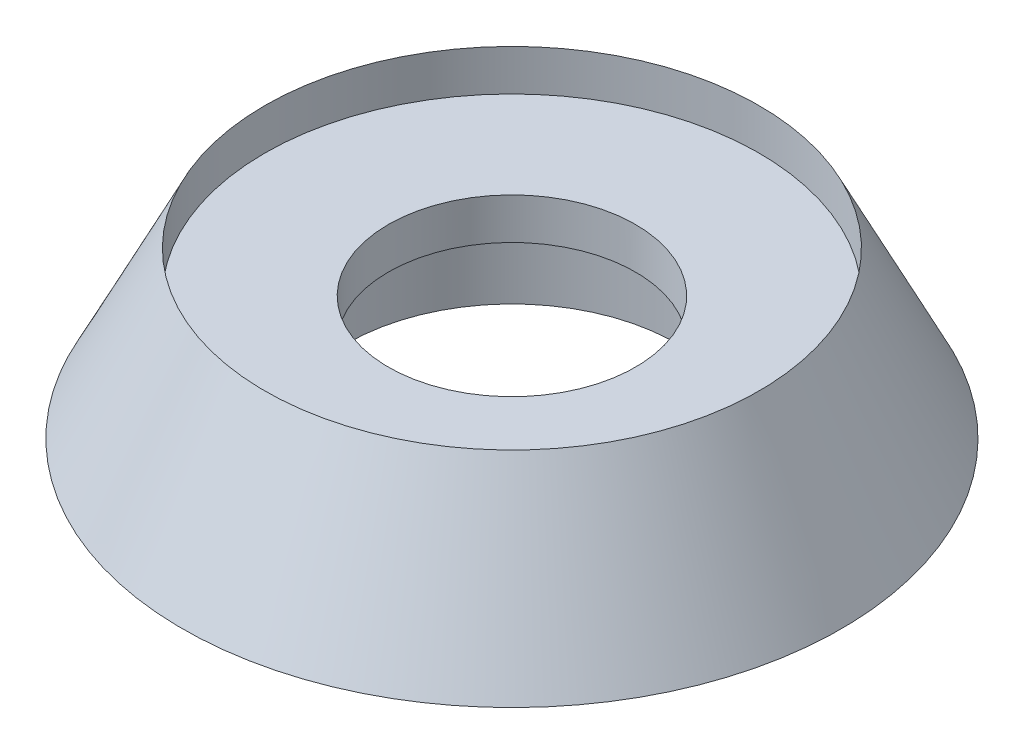
ISO-10303-21;
HEADER;
FILE_DESCRIPTION(('STEP AP214'),'2;1');
FILE_NAME('part.step','',(''),(''),'','','');
FILE_SCHEMA(('AUTOMOTIVE_DESIGN { 1 0 10303 214 1 1 1 1 }'));
ENDSEC;
DATA;
#1=APPLICATION_CONTEXT('core data for automotive mechanical design processes');
#2=APPLICATION_PROTOCOL_DEFINITION('international standard','automotive_design',2000,#1);
#3=PRODUCT_CONTEXT('',#1,'mechanical');
#4=PRODUCT('Part','Part','',(#3));
#5=PRODUCT_RELATED_PRODUCT_CATEGORY('part','',(#4));
#6=PRODUCT_DEFINITION_FORMATION('','',#4);
#7=PRODUCT_DEFINITION_CONTEXT('part definition',#1,'design');
#8=PRODUCT_DEFINITION('design','',#6,#7);
#9=PRODUCT_DEFINITION_SHAPE('','',#8);
#10=(LENGTH_UNIT() NAMED_UNIT(*) SI_UNIT(.MILLI.,.METRE.));
#11=(NAMED_UNIT(*) PLANE_ANGLE_UNIT() SI_UNIT($,.RADIAN.));
#12=(NAMED_UNIT(*) SI_UNIT($,.STERADIAN.) SOLID_ANGLE_UNIT());
#13=UNCERTAINTY_MEASURE_WITH_UNIT(LENGTH_MEASURE(1.E-05),#10,'distance_accuracy_value','');
#14=(GEOMETRIC_REPRESENTATION_CONTEXT(3) GLOBAL_UNCERTAINTY_ASSIGNED_CONTEXT((#13)) GLOBAL_UNIT_ASSIGNED_CONTEXT((#10,
#11,#12)) REPRESENTATION_CONTEXT('',''));
#15=CARTESIAN_POINT('',(0.,0.,0.));
#16=DIRECTION('',(0.,0.,1.));
#17=DIRECTION('',(1.,0.,0.));
#18=AXIS2_PLACEMENT_3D('',#15,#16,#17);
#19=CARTESIAN_POINT('',(0.,-20.,0.));
#20=DIRECTION('',(0.,1.,0.));
#21=DIRECTION('',(-1.,0.,0.));
#22=AXIS2_PLACEMENT_3D('',#19,#20,#21);
#23=CYLINDRICAL_SURFACE('',#22,15.);
#24=CARTESIAN_POINT('',(0.,-5.,0.));
#25=DIRECTION('',(0.,1.,0.));
#26=DIRECTION('',(-1.,0.,0.));
#27=AXIS2_PLACEMENT_3D('',#24,#25,#26);
#28=CIRCLE('',#27,15.);
#29=CARTESIAN_POINT('',(-15.,-5.,0.));
#30=VERTEX_POINT('',#29);
#31=EDGE_CURVE('E53',#30,#30,#28,.T.);
#32=ORIENTED_EDGE('',*,*,#31,.T.);
#33=EDGE_LOOP('',(#32));
#34=FACE_BOUND('',#33,.T.);
#35=CARTESIAN_POINT('',(0.,-10.,0.));
#36=DIRECTION('',(0.,-1.,0.));
#37=DIRECTION('',(1.,0.,0.));
#38=AXIS2_PLACEMENT_3D('',#35,#36,#37);
#39=CIRCLE('',#38,15.);
#40=CARTESIAN_POINT('',(15.,-10.,0.));
#41=VERTEX_POINT('',#40);
#42=EDGE_CURVE('E41',#41,#41,#39,.F.);
#43=ORIENTED_EDGE('',*,*,#42,.F.);
#44=EDGE_LOOP('',(#43));
#45=FACE_BOUND('',#44,.T.);
#46=ADVANCED_FACE('F37',(#34,#45),#23,.F.);
#47=CARTESIAN_POINT('',(0.,-20.,0.));
#48=DIRECTION('',(0.,1.,0.));
#49=DIRECTION('',(-1.,0.,0.));
#50=AXIS2_PLACEMENT_3D('',#47,#48,#49);
#51=PLANE('',#50);
#52=CARTESIAN_POINT('',(0.,-20.,0.));
#53=DIRECTION('',(0.,-1.,0.));
#54=DIRECTION('',(1.,0.,0.));
#55=AXIS2_PLACEMENT_3D('',#52,#53,#54);
#56=CIRCLE('',#55,20.);
#57=CARTESIAN_POINT('',(20.,-20.,0.));
#58=VERTEX_POINT('',#57);
#59=EDGE_CURVE('E57',#58,#58,#56,.T.);
#60=ORIENTED_EDGE('',*,*,#59,.F.);
#61=EDGE_LOOP('',(#60));
#62=FACE_BOUND('',#61,.T.);
#63=CARTESIAN_POINT('',(0.,-20.,0.));
#64=DIRECTION('',(0.,1.,0.));
#65=DIRECTION('',(-1.,0.,0.));
#66=AXIS2_PLACEMENT_3D('',#63,#64,#65);
#67=CIRCLE('',#66,40.);
#68=CARTESIAN_POINT('',(-40.,-20.,0.));
#69=VERTEX_POINT('',#68);
#70=EDGE_CURVE('E10',#69,#69,#67,.T.);
#71=ORIENTED_EDGE('',*,*,#70,.F.);
#72=EDGE_LOOP('',(#71));
#73=FACE_BOUND('',#72,.T.);
#74=ADVANCED_FACE('F39',(#62,#73),#51,.F.);
#75=CARTESIAN_POINT('',(0.,-20.,0.));
#76=DIRECTION('',(0.,-1.,0.));
#77=DIRECTION('',(1.,0.,0.));
#78=AXIS2_PLACEMENT_3D('',#75,#76,#77);
#79=CONICAL_SURFACE('',#78,40.,0.463647609000806);
#80=CARTESIAN_POINT('',(0.,0.,0.));
#81=DIRECTION('',(0.,1.,0.));
#82=DIRECTION('',(-1.,0.,0.));
#83=AXIS2_PLACEMENT_3D('',#80,#81,#82);
#84=CIRCLE('',#83,30.);
#85=CARTESIAN_POINT('',(-30.,0.,0.));
#86=VERTEX_POINT('',#85);
#87=EDGE_CURVE('E49',#86,#86,#84,.T.);
#88=ORIENTED_EDGE('',*,*,#87,.F.);
#89=EDGE_LOOP('',(#88));
#90=FACE_BOUND('',#89,.T.);
#91=ORIENTED_EDGE('',*,*,#70,.T.);
#92=EDGE_LOOP('',(#91));
#93=FACE_BOUND('',#92,.T.);
#94=ADVANCED_FACE('F76',(#90,#93),#79,.T.);
#95=CARTESIAN_POINT('',(0.,-5.,0.));
#96=DIRECTION('',(0.,1.,0.));
#97=DIRECTION('',(-1.,0.,0.));
#98=AXIS2_PLACEMENT_3D('',#95,#96,#97);
#99=CYLINDRICAL_SURFACE('',#98,30.);
#100=CARTESIAN_POINT('',(0.,-5.,0.));
#101=DIRECTION('',(0.,1.,0.));
#102=DIRECTION('',(-1.,0.,0.));
#103=AXIS2_PLACEMENT_3D('',#100,#101,#102);
#104=CIRCLE('',#103,30.);
#105=CARTESIAN_POINT('',(-30.,-5.,0.));
#106=VERTEX_POINT('',#105);
#107=EDGE_CURVE('E45',#106,#106,#104,.T.);
#108=ORIENTED_EDGE('',*,*,#107,.F.);
#109=EDGE_LOOP('',(#108));
#110=FACE_BOUND('',#109,.T.);
#111=ORIENTED_EDGE('',*,*,#87,.T.);
#112=EDGE_LOOP('',(#111));
#113=FACE_BOUND('',#112,.T.);
#114=ADVANCED_FACE('F84',(#110,#113),#99,.F.);
#115=CARTESIAN_POINT('',(0.,-5.,0.));
#116=DIRECTION('',(0.,1.,0.));
#117=DIRECTION('',(-1.,0.,0.));
#118=AXIS2_PLACEMENT_3D('',#115,#116,#117);
#119=PLANE('',#118);
#120=ORIENTED_EDGE('',*,*,#31,.F.);
#121=EDGE_LOOP('',(#120));
#122=FACE_BOUND('',#121,.T.);
#123=ORIENTED_EDGE('',*,*,#107,.T.);
#124=EDGE_LOOP('',(#123));
#125=FACE_BOUND('',#124,.T.);
#126=ADVANCED_FACE('F82',(#122,#125),#119,.T.);
#127=CARTESIAN_POINT('',(0.,-10.,0.));
#128=DIRECTION('',(0.,-1.,0.));
#129=DIRECTION('',(1.,0.,0.));
#130=AXIS2_PLACEMENT_3D('',#127,#128,#129);
#131=PLANE('',#130);
#132=CARTESIAN_POINT('',(0.,-10.,0.));
#133=DIRECTION('',(0.,-1.,0.));
#134=DIRECTION('',(1.,0.,0.));
#135=AXIS2_PLACEMENT_3D('',#132,#133,#134);
#136=CIRCLE('',#135,20.);
#137=CARTESIAN_POINT('',(20.,-10.,0.));
#138=VERTEX_POINT('',#137);
#139=EDGE_CURVE('E60',#138,#138,#136,.T.);
#140=ORIENTED_EDGE('',*,*,#139,.T.);
#141=EDGE_LOOP('',(#140));
#142=FACE_BOUND('',#141,.T.);
#143=ORIENTED_EDGE('',*,*,#42,.T.);
#144=EDGE_LOOP('',(#143));
#145=FACE_BOUND('',#144,.T.);
#146=ADVANCED_FACE('F67',(#142,#145),#131,.T.);
#147=CARTESIAN_POINT('',(0.,-10.,0.));
#148=DIRECTION('',(0.,-1.,0.));
#149=DIRECTION('',(1.,0.,0.));
#150=AXIS2_PLACEMENT_3D('',#147,#148,#149);
#151=CYLINDRICAL_SURFACE('',#150,20.);
#152=ORIENTED_EDGE('',*,*,#139,.F.);
#153=EDGE_LOOP('',(#152));
#154=FACE_BOUND('',#153,.T.);
#155=ORIENTED_EDGE('',*,*,#59,.T.);
#156=EDGE_LOOP('',(#155));
#157=FACE_BOUND('',#156,.T.);
#158=ADVANCED_FACE('F80',(#154,#157),#151,.F.);
#159=CLOSED_SHELL('',(#46,#74,#94,#114,#126,#146,#158));
#160=MANIFOLD_SOLID_BREP('B2',#159);
#161=ADVANCED_BREP_SHAPE_REPRESENTATION('',(#18,#160),#14);
#162=SHAPE_DEFINITION_REPRESENTATION(#9,#161);
ENDSEC;
END-ISO-10303-21;
